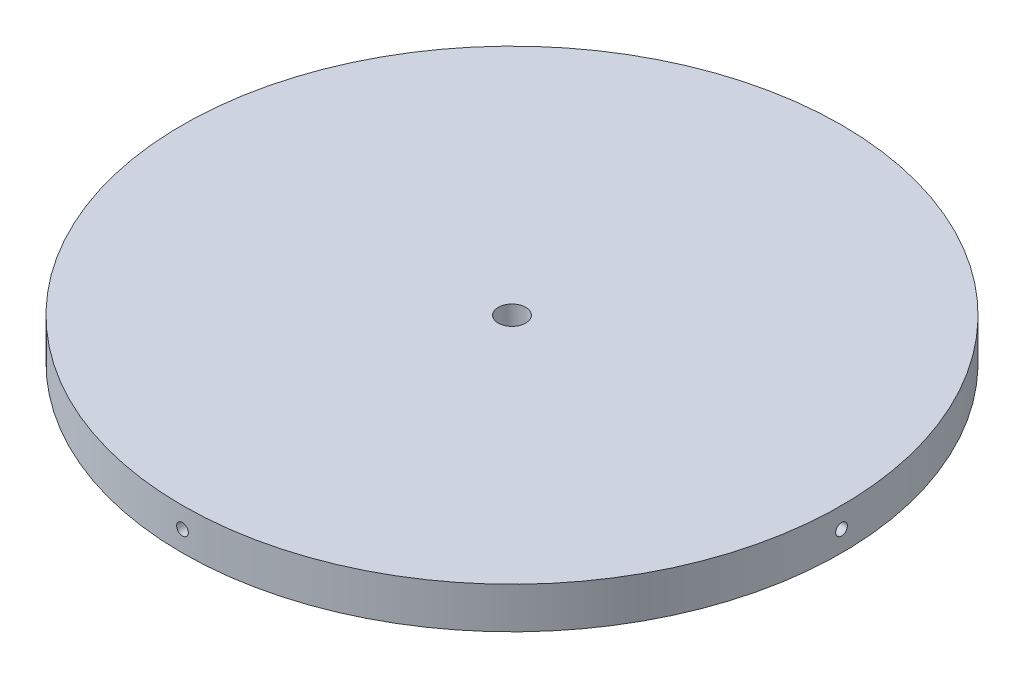
ISO-10303-21;
HEADER;
FILE_DESCRIPTION(('STEP AP214'),'2;1');
FILE_NAME('part.step','',(''),(''),'','','');
FILE_SCHEMA(('AUTOMOTIVE_DESIGN { 1 0 10303 214 1 1 1 1 }'));
ENDSEC;
DATA;
#1=APPLICATION_CONTEXT('core data for automotive mechanical design processes');
#2=APPLICATION_PROTOCOL_DEFINITION('international standard','automotive_design',2000,#1);
#3=PRODUCT_CONTEXT('',#1,'mechanical');
#4=PRODUCT('Part','Part','',(#3));
#5=PRODUCT_RELATED_PRODUCT_CATEGORY('part','',(#4));
#6=PRODUCT_DEFINITION_FORMATION('','',#4);
#7=PRODUCT_DEFINITION_CONTEXT('part definition',#1,'design');
#8=PRODUCT_DEFINITION('design','',#6,#7);
#9=PRODUCT_DEFINITION_SHAPE('','',#8);
#10=(LENGTH_UNIT() NAMED_UNIT(*) SI_UNIT(.MILLI.,.METRE.));
#11=(NAMED_UNIT(*) PLANE_ANGLE_UNIT() SI_UNIT($,.RADIAN.));
#12=(NAMED_UNIT(*) SI_UNIT($,.STERADIAN.) SOLID_ANGLE_UNIT());
#13=UNCERTAINTY_MEASURE_WITH_UNIT(LENGTH_MEASURE(1.E-05),#10,'distance_accuracy_value','');
#14=(GEOMETRIC_REPRESENTATION_CONTEXT(3) GLOBAL_UNCERTAINTY_ASSIGNED_CONTEXT((#13)) GLOBAL_UNIT_ASSIGNED_CONTEXT((#10,
#11,#12)) REPRESENTATION_CONTEXT('',''));
#15=CARTESIAN_POINT('',(0.,0.,0.));
#16=DIRECTION('',(0.,0.,1.));
#17=DIRECTION('',(1.,0.,0.));
#18=AXIS2_PLACEMENT_3D('',#15,#16,#17);
#19=CARTESIAN_POINT('',(0.,9.525,0.));
#20=DIRECTION('',(0.,1.,0.));
#21=DIRECTION('',(0.,0.,1.));
#22=AXIS2_PLACEMENT_3D('',#19,#20,#21);
#23=PLANE('',#22);
#24=CARTESIAN_POINT('',(0.,9.525,0.));
#25=DIRECTION('',(0.,1.,0.));
#26=DIRECTION('',(0.,0.,1.));
#27=AXIS2_PLACEMENT_3D('',#24,#25,#26);
#28=CIRCLE('',#27,76.1746);
#29=CARTESIAN_POINT('',(0.,9.525,76.1746));
#30=VERTEX_POINT('',#29);
#31=EDGE_CURVE('E87',#30,#30,#28,.T.);
#32=ORIENTED_EDGE('',*,*,#31,.T.);
#33=EDGE_LOOP('',(#32));
#34=FACE_BOUND('',#33,.T.);
#35=CARTESIAN_POINT('',(0.,9.525,0.));
#36=DIRECTION('',(0.,1.,0.));
#37=DIRECTION('',(0.,0.,1.));
#38=AXIS2_PLACEMENT_3D('',#35,#36,#37);
#39=CIRCLE('',#38,3.175);
#40=CARTESIAN_POINT('',(0.,9.525,-3.175));
#41=VERTEX_POINT('',#40);
#42=EDGE_CURVE('E81',#41,#41,#39,.T.);
#43=ORIENTED_EDGE('',*,*,#42,.F.);
#44=EDGE_LOOP('',(#43));
#45=FACE_BOUND('',#44,.T.);
#46=ADVANCED_FACE('F34',(#34,#45),#23,.T.);
#47=CARTESIAN_POINT('',(0.,0.,0.));
#48=DIRECTION('',(0.,1.,0.));
#49=DIRECTION('',(0.,0.,1.));
#50=AXIS2_PLACEMENT_3D('',#47,#48,#49);
#51=PLANE('',#50);
#52=CARTESIAN_POINT('',(0.,0.,0.));
#53=DIRECTION('',(0.,1.,0.));
#54=DIRECTION('',(0.,0.,1.));
#55=AXIS2_PLACEMENT_3D('',#52,#53,#54);
#56=CIRCLE('',#55,76.1746);
#57=CARTESIAN_POINT('',(0.,0.,76.1746));
#58=VERTEX_POINT('',#57);
#59=EDGE_CURVE('E84',#58,#58,#56,.T.);
#60=ORIENTED_EDGE('',*,*,#59,.F.);
#61=EDGE_LOOP('',(#60));
#62=FACE_BOUND('',#61,.T.);
#63=CARTESIAN_POINT('',(0.,0.,0.));
#64=DIRECTION('',(0.,1.,0.));
#65=DIRECTION('',(0.,0.,1.));
#66=AXIS2_PLACEMENT_3D('',#63,#64,#65);
#67=CIRCLE('',#66,3.175);
#68=CARTESIAN_POINT('',(0.,0.,-3.175));
#69=VERTEX_POINT('',#68);
#70=EDGE_CURVE('E80',#69,#69,#67,.T.);
#71=ORIENTED_EDGE('',*,*,#70,.T.);
#72=EDGE_LOOP('',(#71));
#73=FACE_BOUND('',#72,.T.);
#74=ADVANCED_FACE('F120',(#62,#73),#51,.F.);
#75=CARTESIAN_POINT('',(0.,9.525,0.));
#76=DIRECTION('',(0.,-1.,0.));
#77=DIRECTION('',(0.,0.,-1.));
#78=AXIS2_PLACEMENT_3D('',#75,#76,#77);
#79=CYLINDRICAL_SURFACE('',#78,76.1746);
#80=CARTESIAN_POINT('',(76.1625911695335,4.7625,-1.35255000000079));
#81=CARTESIAN_POINT('',(76.1625913318178,4.68653309786871,-1.35254663318594));
#82=CARTESIAN_POINT('',(76.1627060477417,4.61051126497765,-1.34612842213873));
#83=CARTESIAN_POINT('',(76.1631526381052,4.46056172084743,-1.3206142161901));
#84=CARTESIAN_POINT('',(76.1634847732258,4.3866366347137,-1.30150300224006));
#85=CARTESIAN_POINT('',(76.1643285653673,4.24307464772097,-1.25114740979543));
#86=CARTESIAN_POINT('',(76.1648401359019,4.17343569996043,-1.21990887577359));
#87=CARTESIAN_POINT('',(76.1659850439857,4.04041009425597,-1.14619354351088));
#88=CARTESIAN_POINT('',(76.1666183514398,3.9770218968928,-1.10371952185477));
#89=CARTESIAN_POINT('',(76.1679355660639,3.85826137607147,-1.00872536322316));
#90=CARTESIAN_POINT('',(76.1686194834858,3.80289068345009,-0.956203187386675));
#91=CARTESIAN_POINT('',(76.1699607411956,3.70175037900739,-0.84260635603765));
#92=CARTESIAN_POINT('',(76.1706180804338,3.65598114608205,-0.781531363169549));
#93=CARTESIAN_POINT('',(76.1718320812533,3.57534349835677,-0.652560465586628));
#94=CARTESIAN_POINT('',(76.1723887380619,3.54047560024732,-0.584664237767256));
#95=CARTESIAN_POINT('',(76.1733385746897,3.48263395049007,-0.443980593985543));
#96=CARTESIAN_POINT('',(76.1737317549518,3.45966016660453,-0.371193191280818));
#97=CARTESIAN_POINT('',(76.1743102772881,3.42626112549406,-0.222801407657146));
#98=CARTESIAN_POINT('',(76.1744956411789,3.41583455104581,-0.147197323296592));
#99=CARTESIAN_POINT('',(76.1746377065854,3.40782186013706,0.00468828794464257));
#100=CARTESIAN_POINT('',(76.1745944086883,3.41023571069592,0.0809698130848129));
#101=CARTESIAN_POINT('',(76.1742840512528,3.42783418744218,0.232035998008856));
#102=CARTESIAN_POINT('',(76.1740170168757,3.44301737759825,0.30682082514221));
#103=CARTESIAN_POINT('',(76.1732893175446,3.4857213252721,0.452779916711149));
#104=CARTESIAN_POINT('',(76.1728286523085,3.5132421007662,0.523954175885833));
#105=CARTESIAN_POINT('',(76.1717655783832,3.5798416417419,0.660676284030646));
#106=CARTESIAN_POINT('',(76.1711631616189,3.61892106571735,0.726223812172487));
#107=CARTESIAN_POINT('',(76.1698844932242,3.70752806105337,0.849828238940553));
#108=CARTESIAN_POINT('',(76.169208241554,3.75705563803346,0.907885133537938));
#109=CARTESIAN_POINT('',(76.1678580243648,3.86516117015754,1.01486865597108));
#110=CARTESIAN_POINT('',(76.1671840591745,3.92374037464282,1.06379402137592));
#111=CARTESIAN_POINT('',(76.165914493049,4.04828187743854,1.1511159371692));
#112=CARTESIAN_POINT('',(76.1653188921247,4.11424417678791,1.18951248607604));
#113=CARTESIAN_POINT('',(76.1642732138611,4.25168009404666,1.25468665966714));
#114=CARTESIAN_POINT('',(76.1638231370003,4.32315373007827,1.28146424614435));
#115=CARTESIAN_POINT('',(76.1631192730441,4.46958309676921,1.32263956423576));
#116=CARTESIAN_POINT('',(76.1628654857557,4.54453882400502,1.33703730802132));
#117=CARTESIAN_POINT('',(76.1625828484964,4.69579364816456,1.35304269240563));
#118=CARTESIAN_POINT('',(76.1625539678065,4.77209256020158,1.35465207971175));
#119=CARTESIAN_POINT('',(76.1627243198163,4.92387750401343,1.34503961511816));
#120=CARTESIAN_POINT('',(76.1629235524302,4.99936353609414,1.33381776804693));
#121=CARTESIAN_POINT('',(76.163527642029,5.14737504847621,1.29886283211518));
#122=CARTESIAN_POINT('',(76.1639324860076,5.21990071572595,1.27513053461639));
#123=CARTESIAN_POINT('',(76.1649021458778,5.3599384524946,1.21582918789614));
#124=CARTESIAN_POINT('',(76.1654669618686,5.42745051889775,1.18026013131863));
#125=CARTESIAN_POINT('',(76.1666929646331,5.55555265144326,1.09829045300828));
#126=CARTESIAN_POINT('',(76.1673541618726,5.61614196457616,1.05188865463172));
#127=CARTESIAN_POINT('',(76.1686983478926,5.72867110910763,0.949572408402749));
#128=CARTESIAN_POINT('',(76.1693813366983,5.78061093050641,0.893657949552762));
#129=CARTESIAN_POINT('',(76.1706921961768,5.87437249039245,0.773896138553624));
#130=CARTESIAN_POINT('',(76.1713200607014,5.9161931011722,0.710047903445597));
#131=CARTESIAN_POINT('',(76.172449800465,5.98852135229293,0.576235552859802));
#132=CARTESIAN_POINT('',(76.1729516758898,6.01902900933406,0.506271446410454));
#133=CARTESIAN_POINT('',(76.1737728288505,6.06786339526051,0.362217653866183));
#134=CARTESIAN_POINT('',(76.1740921174107,6.08619085957265,0.288128217147021));
#135=CARTESIAN_POINT('',(76.1745121451594,6.11014703050433,0.137923290346605));
#136=CARTESIAN_POINT('',(76.1746128841591,6.11577572614824,0.0618077985142768));
#137=CARTESIAN_POINT('',(76.1745844558271,6.11417445973102,-0.0902771157054055));
#138=CARTESIAN_POINT('',(76.1744553205151,6.10694628852903,-0.166246556960894));
#139=CARTESIAN_POINT('',(76.1739817621638,6.07984012377235,-0.315893573384177));
#140=CARTESIAN_POINT('',(76.1736373386937,6.05996210489637,-0.389571143964009));
#141=CARTESIAN_POINT('',(76.172772016909,6.00812045662003,-0.532544410246637));
#142=CARTESIAN_POINT('',(76.1722511153782,5.97615660696814,-0.601840026066066));
#143=CARTESIAN_POINT('',(76.171091570252,5.90105214198545,-0.734079137418544));
#144=CARTESIAN_POINT('',(76.1704529311519,5.85791195335362,-0.797022875331085));
#145=CARTESIAN_POINT('',(76.1691298427897,5.76167753104772,-0.914777610084021));
#146=CARTESIAN_POINT('',(76.1684453920218,5.70858297009328,-0.969588339420757));
#147=CARTESIAN_POINT('',(76.1671076722016,5.59393010957159,-1.06953236851041));
#148=CARTESIAN_POINT('',(76.1664544109313,5.53236971241236,-1.11466326276146));
#149=CARTESIAN_POINT('',(76.1652525839246,5.40251728126712,-1.193969380067));
#150=CARTESIAN_POINT('',(76.1647040746045,5.33422164974635,-1.22813870625481));
#151=CARTESIAN_POINT('',(76.1637747249306,5.19291543897584,-1.28448687045357));
#152=CARTESIAN_POINT('',(76.1633936840465,5.11991061945161,-1.30668005624902));
#153=CARTESIAN_POINT('',(76.162944445983,4.99911830304652,-1.33254273142713));
#154=CARTESIAN_POINT('',(76.1628125397191,4.95211539888689,-1.34003606670425));
#155=CARTESIAN_POINT('',(76.1626358507074,4.85758217076169,-1.35004075447477));
#156=CARTESIAN_POINT('',(76.1625910679508,4.81005184684975,-1.35255210747469));
#157=CARTESIAN_POINT('',(76.1625911695335,4.7625,-1.35255000000079));
#158=B_SPLINE_CURVE_WITH_KNOTS('',3,(#80,#81,#82,#83,#84,#85,#86,#87,#88,#89,#90,#91,#92,#93,
#94,#95,#96,#97,#98,#99,#100,#101,#102,#103,#104,#105,#106,#107,#108,#109,#110,#111,#112,#113,
#114,#115,#116,#117,#118,#119,#120,#121,#122,#123,#124,#125,#126,#127,#128,#129,#130,#131,#132,
#133,#134,#135,#136,#137,#138,#139,#140,#141,#142,#143,#144,#145,#146,#147,#148,#149,#150,#151,
#152,#153,#154,#155,#156,#157),.UNSPECIFIED.,.T.,.F.,(4,2,2,2,2,2,2,2,2,2,2,2,2,2,2,2,2,2,2,2,2,
2,2,2,2,2,2,2,2,2,2,2,2,2,2,2,2,2,4),(0.,0.227727140072635,0.455727821586148,0.683618759737946,
0.911453432568021,1.1393343842314,1.36722432691727,1.59512506926415,1.823025193907,
2.05090139119322,2.27877700317945,2.50662699185412,2.73447731251577,2.96234061626461,
3.19020404256931,3.41809894762149,3.64599388474286,3.8738895712536,4.10178503370631,
4.3296493683493,4.55751361724546,4.78536345407753,5.01321343250887,5.24108817134626,
5.46896317363123,5.69686355913317,5.9247636082078,6.15264989567459,6.38053638010493,
6.60839112424907,6.83624632449302,7.06410567735778,7.29195633211224,7.51981447946663,
7.7477291856114,7.97576629555885,8.20352960007281,8.34607651044311,8.48862340632087),.UNSPECIFIED.);
#159=CARTESIAN_POINT('',(76.1625911695335,4.7625,-1.35255000000079));
#160=VERTEX_POINT('',#159);
#161=EDGE_CURVE('E11',#160,#160,#158,.T.);
#162=ORIENTED_EDGE('',*,*,#161,.T.);
#163=EDGE_LOOP('',(#162));
#164=FACE_BOUND('',#163,.T.);
#165=CARTESIAN_POINT('',(1.35254999999999,4.7625,76.1625911695335));
#166=CARTESIAN_POINT('',(1.35254663318514,4.68653309786871,76.1625913318179));
#167=CARTESIAN_POINT('',(1.34612842213793,4.61051126497765,76.1627060477417));
#168=CARTESIAN_POINT('',(1.3206142161893,4.46056172084743,76.1631526381052));
#169=CARTESIAN_POINT('',(1.30150300223926,4.3866366347137,76.1634847732259));
#170=CARTESIAN_POINT('',(1.25114740979463,4.24307464772097,76.1643285653673));
#171=CARTESIAN_POINT('',(1.2199088757728,4.17343569996043,76.164840135902));
#172=CARTESIAN_POINT('',(1.14619354351008,4.04041009425597,76.1659850439857));
#173=CARTESIAN_POINT('',(1.10371952185397,3.9770218968928,76.1666183514398));
#174=CARTESIAN_POINT('',(1.00872536322236,3.85826137607147,76.1679355660639));
#175=CARTESIAN_POINT('',(0.956203187385877,3.80289068345009,76.1686194834858));
#176=CARTESIAN_POINT('',(0.842606356036852,3.70175037900739,76.1699607411956));
#177=CARTESIAN_POINT('',(0.781531363168751,3.65598114608205,76.1706180804338));
#178=CARTESIAN_POINT('',(0.65256046558583,3.57534349835677,76.1718320812533));
#179=CARTESIAN_POINT('',(0.584664237766458,3.54047560024732,76.1723887380619));
#180=CARTESIAN_POINT('',(0.443980593984745,3.48263395049007,76.1733385746897));
#181=CARTESIAN_POINT('',(0.371193191280021,3.45966016660453,76.1737317549518));
#182=CARTESIAN_POINT('',(0.222801407656348,3.42626112549406,76.1743102772881));
#183=CARTESIAN_POINT('',(0.147197323295794,3.41583455104581,76.1744956411789));
#184=CARTESIAN_POINT('',(-0.00468828794544046,3.40782186013706,76.1746377065854));
#185=CARTESIAN_POINT('',(-0.080969813085611,3.41023571069592,76.1745944086883));
#186=CARTESIAN_POINT('',(-0.232035998009655,3.42783418744218,76.1742840512528));
#187=CARTESIAN_POINT('',(-0.306820825143009,3.44301737759825,76.1740170168757));
#188=CARTESIAN_POINT('',(-0.452779916711947,3.4857213252721,76.1732893175446));
#189=CARTESIAN_POINT('',(-0.523954175886632,3.5132421007662,76.1728286523085));
#190=CARTESIAN_POINT('',(-0.660676284031444,3.5798416417419,76.1717655783832));
#191=CARTESIAN_POINT('',(-0.726223812173285,3.61892106571735,76.1711631616189));
#192=CARTESIAN_POINT('',(-0.849828238941351,3.70752806105337,76.1698844932242));
#193=CARTESIAN_POINT('',(-0.907885133538735,3.75705563803346,76.169208241554));
#194=CARTESIAN_POINT('',(-1.01486865597188,3.86516117015754,76.1678580243648));
#195=CARTESIAN_POINT('',(-1.06379402137672,3.92374037464282,76.1671840591745));
#196=CARTESIAN_POINT('',(-1.15111593717,4.04828187743854,76.1659144930489));
#197=CARTESIAN_POINT('',(-1.18951248607684,4.11424417678791,76.1653188921247));
#198=CARTESIAN_POINT('',(-1.25468665966794,4.25168009404666,76.1642732138611));
#199=CARTESIAN_POINT('',(-1.28146424614514,4.32315373007827,76.1638231370003));
#200=CARTESIAN_POINT('',(-1.32263956423656,4.46958309676921,76.1631192730441));
#201=CARTESIAN_POINT('',(-1.33703730802212,4.54453882400502,76.1628654857557));
#202=CARTESIAN_POINT('',(-1.35304269240643,4.69579364816456,76.1625828484964));
#203=CARTESIAN_POINT('',(-1.35465207971255,4.77209256020158,76.1625539678065));
#204=CARTESIAN_POINT('',(-1.34503961511896,4.92387750401343,76.1627243198163));
#205=CARTESIAN_POINT('',(-1.33381776804773,4.99936353609414,76.1629235524302));
#206=CARTESIAN_POINT('',(-1.29886283211598,5.14737504847621,76.1635276420289));
#207=CARTESIAN_POINT('',(-1.27513053461719,5.21990071572595,76.1639324860076));
#208=CARTESIAN_POINT('',(-1.21582918789694,5.3599384524946,76.1649021458777));
#209=CARTESIAN_POINT('',(-1.18026013131943,5.42745051889775,76.1654669618686));
#210=CARTESIAN_POINT('',(-1.09829045300907,5.55555265144326,76.1666929646331));
#211=CARTESIAN_POINT('',(-1.05188865463252,5.61614196457616,76.1673541618726));
#212=CARTESIAN_POINT('',(-0.949572408403547,5.72867110910763,76.1686983478926));
#213=CARTESIAN_POINT('',(-0.89365794955356,5.78061093050641,76.1693813366983));
#214=CARTESIAN_POINT('',(-0.773896138554421,5.87437249039245,76.1706921961767));
#215=CARTESIAN_POINT('',(-0.710047903446395,5.9161931011722,76.1713200607014));
#216=CARTESIAN_POINT('',(-0.576235552860599,5.98852135229293,76.1724498004649));
#217=CARTESIAN_POINT('',(-0.506271446411252,6.01902900933406,76.1729516758898));
#218=CARTESIAN_POINT('',(-0.362217653866981,6.06786339526051,76.1737728288505));
#219=CARTESIAN_POINT('',(-0.288128217147819,6.08619085957265,76.1740921174107));
#220=CARTESIAN_POINT('',(-0.137923290347403,6.11014703050433,76.1745121451594));
#221=CARTESIAN_POINT('',(-0.0618077985150745,6.11577572614824,76.1746128841591));
#222=CARTESIAN_POINT('',(0.0902771157046079,6.11417445973102,76.1745844558271));
#223=CARTESIAN_POINT('',(0.166246556960096,6.10694628852903,76.1744553205151));
#224=CARTESIAN_POINT('',(0.315893573383379,6.07984012377235,76.1739817621638));
#225=CARTESIAN_POINT('',(0.389571143963211,6.05996210489637,76.1736373386937));
#226=CARTESIAN_POINT('',(0.53254441024584,6.00812045662003,76.172772016909));
#227=CARTESIAN_POINT('',(0.601840026065269,5.97615660696814,76.1722511153782));
#228=CARTESIAN_POINT('',(0.734079137417747,5.90105214198545,76.171091570252));
#229=CARTESIAN_POINT('',(0.797022875330288,5.85791195335362,76.1704529311519));
#230=CARTESIAN_POINT('',(0.914777610083223,5.76167753104772,76.1691298427897));
#231=CARTESIAN_POINT('',(0.969588339419959,5.70858297009328,76.1684453920218));
#232=CARTESIAN_POINT('',(1.06953236850961,5.59393010957159,76.1671076722016));
#233=CARTESIAN_POINT('',(1.11466326276066,5.53236971241236,76.1664544109313));
#234=CARTESIAN_POINT('',(1.1939693800662,5.40251728126712,76.1652525839247));
#235=CARTESIAN_POINT('',(1.22813870625402,5.33422164974635,76.1647040746045));
#236=CARTESIAN_POINT('',(1.28448687045277,5.19291543897584,76.1637747249306));
#237=CARTESIAN_POINT('',(1.30668005624822,5.11991061945161,76.1633936840466));
#238=CARTESIAN_POINT('',(1.33254273142633,4.99911830304652,76.162944445983));
#239=CARTESIAN_POINT('',(1.34003606670345,4.95211539888689,76.1628125397191));
#240=CARTESIAN_POINT('',(1.35004075447398,4.85758217076169,76.1626358507074));
#241=CARTESIAN_POINT('',(1.3525521074739,4.81005184684975,76.1625910679508));
#242=CARTESIAN_POINT('',(1.35254999999999,4.7625,76.1625911695335));
#243=B_SPLINE_CURVE_WITH_KNOTS('',3,(#165,#166,#167,#168,#169,#170,#171,#172,#173,#174,#175,
#176,#177,#178,#179,#180,#181,#182,#183,#184,#185,#186,#187,#188,#189,#190,#191,#192,#193,#194,
#195,#196,#197,#198,#199,#200,#201,#202,#203,#204,#205,#206,#207,#208,#209,#210,#211,#212,#213,
#214,#215,#216,#217,#218,#219,#220,#221,#222,#223,#224,#225,#226,#227,#228,#229,#230,#231,#232,
#233,#234,#235,#236,#237,#238,#239,#240,#241,#242),.UNSPECIFIED.,.T.,.F.,(4,2,2,2,2,2,2,2,2,2,2,
2,2,2,2,2,2,2,2,2,2,2,2,2,2,2,2,2,2,2,2,2,2,2,2,2,2,2,4),(0.,0.227727140072635,
0.455727821586148,0.683618759737946,0.91145343256802,1.1393343842314,1.36722432691727,
1.59512506926415,1.823025193907,2.05090139119322,2.27877700317946,2.50662699185412,
2.73447731251577,2.96234061626461,3.19020404256931,3.41809894762149,3.64599388474286,
3.8738895712536,4.10178503370631,4.3296493683493,4.55751361724546,4.78536345407753,
5.01321343250887,5.24108817134626,5.46896317363123,5.69686355913317,5.9247636082078,
6.15264989567459,6.38053638010493,6.60839112424907,6.83624632449302,7.06410567735778,
7.29195633211224,7.51981447946663,7.7477291856114,7.97576629555885,8.20352960007281,
8.34607651044311,8.48862340632087),.UNSPECIFIED.);
#244=CARTESIAN_POINT('',(1.35254999999999,4.7625,76.1625911695335));
#245=VERTEX_POINT('',#244);
#246=EDGE_CURVE('E47',#245,#245,#243,.T.);
#247=ORIENTED_EDGE('',*,*,#246,.T.);
#248=EDGE_LOOP('',(#247));
#249=FACE_BOUND('',#248,.T.);
#250=CARTESIAN_POINT('',(-76.1625911695335,4.7625,1.35255000000025));
#251=CARTESIAN_POINT('',(-76.1625913318179,4.68653309786871,1.35254663318541));
#252=CARTESIAN_POINT('',(-76.1627060477417,4.61051126497765,1.3461284221382));
#253=CARTESIAN_POINT('',(-76.1631526381052,4.46056172084743,1.32061421618956));
#254=CARTESIAN_POINT('',(-76.1634847732259,4.3866366347137,1.30150300223953));
#255=CARTESIAN_POINT('',(-76.1643285653673,4.24307464772097,1.2511474097949));
#256=CARTESIAN_POINT('',(-76.164840135902,4.17343569996043,1.21990887577306));
#257=CARTESIAN_POINT('',(-76.1659850439857,4.04041009425597,1.14619354351035));
#258=CARTESIAN_POINT('',(-76.1666183514398,3.9770218968928,1.10371952185424));
#259=CARTESIAN_POINT('',(-76.1679355660639,3.85826137607147,1.00872536322262));
#260=CARTESIAN_POINT('',(-76.1686194834858,3.80289068345009,0.956203187386144));
#261=CARTESIAN_POINT('',(-76.1699607411956,3.70175037900739,0.842606356037118));
#262=CARTESIAN_POINT('',(-76.1706180804338,3.65598114608205,0.781531363169017));
#263=CARTESIAN_POINT('',(-76.1718320812533,3.57534349835677,0.652560465586096));
#264=CARTESIAN_POINT('',(-76.1723887380619,3.54047560024732,0.584664237766724));
#265=CARTESIAN_POINT('',(-76.1733385746897,3.48263395049007,0.443980593985011));
#266=CARTESIAN_POINT('',(-76.1737317549518,3.45966016660453,0.371193191280286));
#267=CARTESIAN_POINT('',(-76.1743102772881,3.42626112549406,0.222801407656614));
#268=CARTESIAN_POINT('',(-76.1744956411789,3.41583455104581,0.14719732329606));
#269=CARTESIAN_POINT('',(-76.1746377065854,3.40782186013706,-0.00468828794517483));
#270=CARTESIAN_POINT('',(-76.1745944086883,3.41023571069592,-0.0809698130853454));
#271=CARTESIAN_POINT('',(-76.1742840512528,3.42783418744218,-0.232035998009389));
#272=CARTESIAN_POINT('',(-76.1740170168757,3.44301737759825,-0.306820825142744));
#273=CARTESIAN_POINT('',(-76.1732893175446,3.4857213252721,-0.452779916711682));
#274=CARTESIAN_POINT('',(-76.1728286523085,3.5132421007662,-0.523954175886366));
#275=CARTESIAN_POINT('',(-76.1717655783832,3.5798416417419,-0.660676284031178));
#276=CARTESIAN_POINT('',(-76.1711631616189,3.61892106571735,-0.726223812173019));
#277=CARTESIAN_POINT('',(-76.1698844932242,3.70752806105337,-0.849828238941086));
#278=CARTESIAN_POINT('',(-76.169208241554,3.75705563803346,-0.90788513353847));
#279=CARTESIAN_POINT('',(-76.1678580243648,3.86516117015754,-1.01486865597161));
#280=CARTESIAN_POINT('',(-76.1671840591745,3.92374037464282,-1.06379402137645));
#281=CARTESIAN_POINT('',(-76.1659144930489,4.04828187743854,-1.15111593716974));
#282=CARTESIAN_POINT('',(-76.1653188921247,4.11424417678791,-1.18951248607658));
#283=CARTESIAN_POINT('',(-76.1642732138611,4.25168009404666,-1.25468665966767));
#284=CARTESIAN_POINT('',(-76.1638231370003,4.32315373007827,-1.28146424614488));
#285=CARTESIAN_POINT('',(-76.1631192730441,4.46958309676921,-1.32263956423629));
#286=CARTESIAN_POINT('',(-76.1628654857557,4.54453882400502,-1.33703730802185));
#287=CARTESIAN_POINT('',(-76.1625828484964,4.69579364816457,-1.35304269240616));
#288=CARTESIAN_POINT('',(-76.1625539678065,4.77209256020158,-1.35465207971228));
#289=CARTESIAN_POINT('',(-76.1627243198163,4.92387750401343,-1.34503961511869));
#290=CARTESIAN_POINT('',(-76.1629235524302,4.99936353609414,-1.33381776804746));
#291=CARTESIAN_POINT('',(-76.163527642029,5.14737504847621,-1.29886283211571));
#292=CARTESIAN_POINT('',(-76.1639324860076,5.21990071572595,-1.27513053461692));
#293=CARTESIAN_POINT('',(-76.1649021458777,5.3599384524946,-1.21582918789667));
#294=CARTESIAN_POINT('',(-76.1654669618686,5.42745051889775,-1.18026013131916));
#295=CARTESIAN_POINT('',(-76.1666929646331,5.55555265144326,-1.09829045300881));
#296=CARTESIAN_POINT('',(-76.1673541618726,5.61614196457616,-1.05188865463225));
#297=CARTESIAN_POINT('',(-76.1686983478926,5.72867110910763,-0.949572408403281));
#298=CARTESIAN_POINT('',(-76.1693813366983,5.78061093050641,-0.893657949553294));
#299=CARTESIAN_POINT('',(-76.1706921961767,5.87437249039245,-0.773896138554155));
#300=CARTESIAN_POINT('',(-76.1713200607014,5.9161931011722,-0.710047903446129));
#301=CARTESIAN_POINT('',(-76.172449800465,5.98852135229293,-0.576235552860333));
#302=CARTESIAN_POINT('',(-76.1729516758898,6.01902900933406,-0.506271446410986));
#303=CARTESIAN_POINT('',(-76.1737728288505,6.06786339526051,-0.362217653866714));
#304=CARTESIAN_POINT('',(-76.1740921174107,6.08619085957265,-0.288128217147552));
#305=CARTESIAN_POINT('',(-76.1745121451594,6.11014703050433,-0.137923290347137));
#306=CARTESIAN_POINT('',(-76.1746128841591,6.11577572614824,-0.061807798514808));
#307=CARTESIAN_POINT('',(-76.1745844558271,6.11417445973102,0.0902771157048748));
#308=CARTESIAN_POINT('',(-76.1744553205151,6.10694628852903,0.166246556960363));
#309=CARTESIAN_POINT('',(-76.1739817621638,6.07984012377235,0.315893573383646));
#310=CARTESIAN_POINT('',(-76.1736373386937,6.05996210489637,0.389571143963478));
#311=CARTESIAN_POINT('',(-76.172772016909,6.00812045662003,0.532544410246106));
#312=CARTESIAN_POINT('',(-76.1722511153782,5.97615660696814,0.601840026065535));
#313=CARTESIAN_POINT('',(-76.171091570252,5.90105214198545,0.734079137418013));
#314=CARTESIAN_POINT('',(-76.1704529311519,5.85791195335362,0.797022875330554));
#315=CARTESIAN_POINT('',(-76.1691298427897,5.76167753104772,0.91477761008349));
#316=CARTESIAN_POINT('',(-76.1684453920219,5.70858297009328,0.969588339420225));
#317=CARTESIAN_POINT('',(-76.1671076722016,5.59393010957159,1.06953236850988));
#318=CARTESIAN_POINT('',(-76.1664544109313,5.53236971241236,1.11466326276093));
#319=CARTESIAN_POINT('',(-76.1652525839246,5.40251728126712,1.19396938006647));
#320=CARTESIAN_POINT('',(-76.1647040746045,5.33422164974635,1.22813870625428));
#321=CARTESIAN_POINT('',(-76.1637747249306,5.19291543897584,1.28448687045303));
#322=CARTESIAN_POINT('',(-76.1633936840466,5.1199106194516,1.30668005624849));
#323=CARTESIAN_POINT('',(-76.162944445983,4.99911830304651,1.3325427314266));
#324=CARTESIAN_POINT('',(-76.1628125397191,4.95211539888689,1.34003606670372));
#325=CARTESIAN_POINT('',(-76.1626358507074,4.85758217076169,1.35004075447424));
#326=CARTESIAN_POINT('',(-76.1625910679508,4.81005184684975,1.35255210747416));
#327=CARTESIAN_POINT('',(-76.1625911695335,4.7625,1.35255000000025));
#328=B_SPLINE_CURVE_WITH_KNOTS('',3,(#250,#251,#252,#253,#254,#255,#256,#257,#258,#259,#260,
#261,#262,#263,#264,#265,#266,#267,#268,#269,#270,#271,#272,#273,#274,#275,#276,#277,#278,#279,
#280,#281,#282,#283,#284,#285,#286,#287,#288,#289,#290,#291,#292,#293,#294,#295,#296,#297,#298,
#299,#300,#301,#302,#303,#304,#305,#306,#307,#308,#309,#310,#311,#312,#313,#314,#315,#316,#317,
#318,#319,#320,#321,#322,#323,#324,#325,#326,#327),.UNSPECIFIED.,.T.,.F.,(4,2,2,2,2,2,2,2,2,2,2,
2,2,2,2,2,2,2,2,2,2,2,2,2,2,2,2,2,2,2,2,2,2,2,2,2,2,2,4),(0.,0.227727140072635,
0.455727821586148,0.683618759737944,0.91145343256802,1.1393343842314,1.36722432691727,
1.59512506926415,1.823025193907,2.05090139119322,2.27877700317946,2.50662699185412,
2.73447731251577,2.96234061626461,3.19020404256931,3.41809894762149,3.64599388474286,
3.8738895712536,4.10178503370631,4.3296493683493,4.55751361724546,4.78536345407753,
5.01321343250888,5.24108817134626,5.46896317363123,5.69686355913317,5.9247636082078,
6.15264989567459,6.38053638010493,6.60839112424907,6.83624632449302,7.06410567735778,
7.29195633211224,7.51981447946663,7.7477291856114,7.97576629555885,8.20352960007281,
8.34607651044311,8.48862340632087),.UNSPECIFIED.);
#329=CARTESIAN_POINT('',(-76.1625911695335,4.7625,1.35255000000025));
#330=VERTEX_POINT('',#329);
#331=EDGE_CURVE('E99',#330,#330,#328,.T.);
#332=ORIENTED_EDGE('',*,*,#331,.T.);
#333=EDGE_LOOP('',(#332));
#334=FACE_BOUND('',#333,.T.);
#335=CARTESIAN_POINT('',(0.,6.11504999999999,-76.1746));
#336=CARTESIAN_POINT('',(-0.0759669031959398,6.11504663318611,-76.1745998378203));
#337=CARTESIAN_POINT('',(-0.151988737147994,6.10862842196507,-76.1744851405251));
#338=CARTESIAN_POINT('',(-0.301938283482509,6.0831142152633,-76.1740386164844));
#339=CARTESIAN_POINT('',(-0.375863370760367,6.06400300073754,-76.1737065290927));
#340=CARTESIAN_POINT('',(-0.519425360171584,6.01364740660829,-76.1728628406467));
#341=CARTESIAN_POINT('',(-0.589064309196794,5.98240887145006,-76.1723513260741));
#342=CARTESIAN_POINT('',(-0.722089917016071,5.90869353651212,-76.1712065135406));
#343=CARTESIAN_POINT('',(-0.785478115230995,5.86621951332,-76.1705732456787));
#344=CARTESIAN_POINT('',(-0.904238635073783,5.77122535314371,-76.1692560766181));
#345=CARTESIAN_POINT('',(-0.959609326138674,5.71870317764102,-76.1685721651624));
#346=CARTESIAN_POINT('',(-1.06074962758195,5.60510634761105,-76.1672308830571));
#347=CARTESIAN_POINT('',(-1.1065188590596,5.544031355724,-76.1665735134558));
#348=CARTESIAN_POINT('',(-1.18715650528408,5.41506045898393,-76.1653594289303));
#349=CARTESIAN_POINT('',(-1.22202440307092,5.34716423085783,-76.1648027187802));
#350=CARTESIAN_POINT('',(-1.27986605214682,5.20648058640919,-76.1638527758335));
#351=CARTESIAN_POINT('',(-1.30283983567756,5.13369318334589,-76.1634595425938));
#352=CARTESIAN_POINT('',(-1.33623887602735,4.98530139869178,-76.1628809379442));
#353=CARTESIAN_POINT('',(-1.34666545004531,4.90969731365389,-76.1626955447155));
#354=CARTESIAN_POINT('',(-1.35467813985884,4.75781170109146,-76.1625534570781));
#355=CARTESIAN_POINT('',(-1.35226428863958,4.68153017530768,-76.1625967620819));
#356=CARTESIAN_POINT('',(-1.33466581086186,4.53046399333399,-76.1629071671051));
#357=CARTESIAN_POINT('',(-1.31948262099914,4.45567916971715,-76.1631742419478));
#358=CARTESIAN_POINT('',(-1.27677867513642,4.30972008503016,-76.1639020377809));
#359=CARTESIAN_POINT('',(-1.24925790115358,4.23854582922281,-76.1643627590535));
#360=CARTESIAN_POINT('',(-1.18265836327778,4.10182372510504,-76.1654259361396));
#361=CARTESIAN_POINT('',(-1.14357894053353,4.03627619779705,-76.166028400032));
#362=CARTESIAN_POINT('',(-1.05497194780953,3.91267177217164,-76.1673071330586));
#363=CARTESIAN_POINT('',(-1.00544437221108,3.85461487788248,-76.1679834022326));
#364=CARTESIAN_POINT('',(-0.897338841049925,3.74763135383609,-76.1693336172077));
#365=CARTESIAN_POINT('',(-0.838759635868295,3.69870598679023,-76.1700075626749));
#366=CARTESIAN_POINT('',(-0.714218131100806,3.61138406802023,-76.1712770606937));
#367=CARTESIAN_POINT('',(-0.648255830478291,3.57298751777443,-76.1718726132344));
#368=CARTESIAN_POINT('',(-0.510819912911578,3.50781334322623,-76.1729181873081));
#369=CARTESIAN_POINT('',(-0.439346278044282,3.48103575671107,-76.1733682083677));
#370=CARTESIAN_POINT('',(-0.292916913878398,3.43986043818532,-76.1740719777359));
#371=CARTESIAN_POINT('',(-0.217961188001414,3.42546269401023,-76.1743257262373));
#372=CARTESIAN_POINT('',(-0.0667063644147724,3.40945730816293,-76.1746083200011));
#373=CARTESIAN_POINT('',(0.00959254844751346,3.40784792015508,-76.1746371959715));
#374=CARTESIAN_POINT('',(0.161377494079737,3.41746038363994,-76.1744668705921));
#375=CARTESIAN_POINT('',(0.236863527155562,3.42868223030407,-76.1742676693282));
#376=CARTESIAN_POINT('',(0.384875044189094,3.46363716640883,-76.173663664801));
#377=CARTESIAN_POINT('',(0.457400714997972,3.48736946489914,-76.1732588745357));
#378=CARTESIAN_POINT('',(0.597438458444466,3.54667081479803,-76.1722893208728));
#379=CARTESIAN_POINT('',(0.664950527968757,3.58223987355686,-76.1717245573758));
#380=CARTESIAN_POINT('',(0.793052662549558,3.66420955502574,-76.1704986354668));
#381=CARTESIAN_POINT('',(0.853641974951883,3.71061135382428,-76.1698374665911));
#382=CARTESIAN_POINT('',(0.966171117811906,3.812927600488,-76.1684933006567));
#383=CARTESIAN_POINT('',(1.0181109382667,3.86884205935417,-76.1678103035729));
#384=CARTESIAN_POINT('',(1.11187249624285,3.98860386992294,-76.1664993945718));
#385=CARTESIAN_POINT('',(1.15369310605572,4.05245210458512,-76.1658714887992));
#386=CARTESIAN_POINT('',(1.22602135547702,4.18626445403353,-76.1647416515947));
#387=CARTESIAN_POINT('',(1.25652901178564,4.25622855979132,-76.1642397199769));
#388=CARTESIAN_POINT('',(1.30536339719808,4.40028235287769,-76.1634184643603));
#389=CARTESIAN_POINT('',(1.32369086141227,4.47437179093779,-76.1630991293414));
#390=CARTESIAN_POINT('',(1.34764703169322,4.6245767205557,-76.1626790387343));
#391=CARTESIAN_POINT('',(1.35327572679142,4.70069221386346,-76.1625782833351));
#392=CARTESIAN_POINT('',(1.35167445883825,4.85277712704119,-76.1626067161695));
#393=CARTESIAN_POINT('',(1.34444628729294,4.92874656578615,-76.1627358723668));
#394=CARTESIAN_POINT('',(1.31734012273543,5.07839357710609,-76.1632095005568));
#395=CARTESIAN_POINT('',(1.29746210439744,5.15207114509229,-76.1635539729806));
#396=CARTESIAN_POINT('',(1.24562045811338,5.29504440637428,-76.1644193993455));
#397=CARTESIAN_POINT('',(1.21365660991066,5.36434001978482,-76.164940356503));
#398=CARTESIAN_POINT('',(1.1385521485672,5.49657912692842,-76.1660999951169));
#399=CARTESIAN_POINT('',(1.09541196212285,5.55952286303949,-76.1667386720787));
#400=CARTESIAN_POINT('',(0.999177542161064,5.67727759804536,-76.168061801904));
#401=CARTESIAN_POINT('',(0.946082980867527,5.73208832903134,-76.1687462562743));
#402=CARTESIAN_POINT('',(0.831430118997713,5.83203236128946,-76.1700839473755));
#403=CARTESIAN_POINT('',(0.769869720832981,5.87716325706396,-76.1707371763155));
#404=CARTESIAN_POINT('',(0.640017288932585,5.95646937593903,-76.1719389169514));
#405=CARTESIAN_POINT('',(0.571721657840508,5.99063870246546,-76.1724873722223));
#406=CARTESIAN_POINT('',(0.430415447990483,6.04698686741764,-76.1734166157479));
#407=CARTESIAN_POINT('',(0.357410628955742,6.06918005362238,-76.1737976045306));
#408=CARTESIAN_POINT('',(0.236618311449319,6.09504272999781,-76.174246777958));
#409=CARTESIAN_POINT('',(0.189615405614296,6.10253606581219,-76.1743786641761));
#410=CARTESIAN_POINT('',(0.0950821741295524,6.11254075429683,-76.1745553259513));
#411=CARTESIAN_POINT('',(0.0475518485334259,6.11505210747334,-76.1746001015172));
#412=CARTESIAN_POINT('',(0.,6.11504999999999,-76.1746));
#413=B_SPLINE_CURVE_WITH_KNOTS('',3,(#335,#336,#337,#338,#339,#340,#341,#342,#343,#344,#345,
#346,#347,#348,#349,#350,#351,#352,#353,#354,#355,#356,#357,#358,#359,#360,#361,#362,#363,#364,
#365,#366,#367,#368,#369,#370,#371,#372,#373,#374,#375,#376,#377,#378,#379,#380,#381,#382,#383,
#384,#385,#386,#387,#388,#389,#390,#391,#392,#393,#394,#395,#396,#397,#398,#399,#400,#401,#402,
#403,#404,#405,#406,#407,#408,#409,#410,#411,#412),.UNSPECIFIED.,.T.,.F.,(4,2,2,2,2,2,2,2,2,2,2,
2,2,2,2,2,2,2,2,2,2,2,2,2,2,2,2,2,2,2,2,2,2,2,2,2,2,2,4),(0.,0.227727143269717,
0.455727827910921,0.683618769709577,0.911453446130337,1.13933439361215,1.36722433222943,
1.59512507614102,1.82302520227312,2.05090140149201,2.27877701533088,2.50662699400251,
2.73447730478141,2.96234060569549,3.19020402914776,3.41809893834134,3.6459938795335,
3.87388956188116,4.10178502029675,4.32964935752718,4.5575136090091,4.78536345592028,
5.01321344431952,5.24108818144064,5.4689631820908,5.6968635659797,5.92476361344074,
6.15264990521509,6.38053639382594,6.60839113068469,6.8362463237248,7.06410566948288,
7.29195631718295,7.51981446883156,7.74772917917171,7.97576628724141,8.20352958998387,
8.34607650539727,8.4886234063257),.UNSPECIFIED.);
#414=CARTESIAN_POINT('',(0.,6.11504999999999,-76.1746));
#415=VERTEX_POINT('',#414);
#416=EDGE_CURVE('E90',#415,#415,#413,.T.);
#417=ORIENTED_EDGE('',*,*,#416,.T.);
#418=EDGE_LOOP('',(#417));
#419=FACE_BOUND('',#418,.T.);
#420=ORIENTED_EDGE('',*,*,#31,.F.);
#421=EDGE_LOOP('',(#420));
#422=FACE_BOUND('',#421,.T.);
#423=ORIENTED_EDGE('',*,*,#59,.T.);
#424=EDGE_LOOP('',(#423));
#425=FACE_BOUND('',#424,.T.);
#426=ADVANCED_FACE('F36',(#164,#249,#334,#419,#422,#425),#79,.T.);
#427=CARTESIAN_POINT('',(0.,9.525,0.));
#428=DIRECTION('',(0.,-1.,0.));
#429=DIRECTION('',(0.,0.,-1.));
#430=AXIS2_PLACEMENT_3D('',#427,#428,#429);
#431=CYLINDRICAL_SURFACE('',#430,3.175);
#432=CARTESIAN_POINT('',(0.,9.525,-3.175));
#433=CARTESIAN_POINT('',(0.,9.42578125,-3.175));
#434=CARTESIAN_POINT('',(0.,9.3265625,-3.175));
#435=CARTESIAN_POINT('',(0.,9.128125,-3.175));
#436=CARTESIAN_POINT('',(0.,9.02890625,-3.175));
#437=CARTESIAN_POINT('',(0.,8.83046875,-3.175));
#438=CARTESIAN_POINT('',(0.,8.73125,-3.175));
#439=CARTESIAN_POINT('',(0.,8.5328125,-3.175));
#440=CARTESIAN_POINT('',(0.,8.43359375,-3.175));
#441=CARTESIAN_POINT('',(0.,8.23515625,-3.175));
#442=CARTESIAN_POINT('',(0.,8.1359375,-3.175));
#443=CARTESIAN_POINT('',(0.,7.9375,-3.175));
#444=CARTESIAN_POINT('',(0.,7.83828125,-3.175));
#445=CARTESIAN_POINT('',(0.,7.63984375,-3.175));
#446=CARTESIAN_POINT('',(0.,7.540625,-3.175));
#447=CARTESIAN_POINT('',(0.,7.3421875,-3.175));
#448=CARTESIAN_POINT('',(0.,7.24296875,-3.175));
#449=CARTESIAN_POINT('',(0.,7.04453125,-3.175));
#450=CARTESIAN_POINT('',(0.,6.9453125,-3.175));
#451=CARTESIAN_POINT('',(0.,6.746875,-3.175));
#452=CARTESIAN_POINT('',(0.,6.64765625,-3.175));
#453=CARTESIAN_POINT('',(0.,6.44921875,-3.175));
#454=CARTESIAN_POINT('',(0.,6.35,-3.175));
#455=CARTESIAN_POINT('',(0.,6.1515625,-3.175));
#456=CARTESIAN_POINT('',(0.,6.05234375,-3.175));
#457=CARTESIAN_POINT('',(0.,5.85390625,-3.175));
#458=CARTESIAN_POINT('',(0.,5.7546875,-3.175));
#459=CARTESIAN_POINT('',(0.,5.55625,-3.175));
#460=CARTESIAN_POINT('',(0.,5.45703125,-3.175));
#461=CARTESIAN_POINT('',(0.,5.25859375,-3.175));
#462=CARTESIAN_POINT('',(0.,5.159375,-3.175));
#463=CARTESIAN_POINT('',(0.,4.9609375,-3.175));
#464=CARTESIAN_POINT('',(0.,4.86171875,-3.175));
#465=CARTESIAN_POINT('',(0.,4.66328125,-3.175));
#466=CARTESIAN_POINT('',(0.,4.5640625,-3.175));
#467=CARTESIAN_POINT('',(0.,4.365625,-3.175));
#468=CARTESIAN_POINT('',(0.,4.26640625,-3.175));
#469=CARTESIAN_POINT('',(0.,4.06796875,-3.175));
#470=CARTESIAN_POINT('',(0.,3.96875,-3.175));
#471=CARTESIAN_POINT('',(0.,3.7703125,-3.175));
#472=CARTESIAN_POINT('',(0.,3.67109375,-3.175));
#473=CARTESIAN_POINT('',(0.,3.47265625,-3.175));
#474=CARTESIAN_POINT('',(0.,3.3734375,-3.175));
#475=CARTESIAN_POINT('',(0.,3.175,-3.175));
#476=CARTESIAN_POINT('',(0.,3.07578125,-3.175));
#477=CARTESIAN_POINT('',(0.,2.87734375,-3.175));
#478=CARTESIAN_POINT('',(0.,2.778125,-3.175));
#479=CARTESIAN_POINT('',(0.,2.5796875,-3.175));
#480=CARTESIAN_POINT('',(0.,2.48046875,-3.175));
#481=CARTESIAN_POINT('',(0.,2.28203125,-3.175));
#482=CARTESIAN_POINT('',(0.,2.1828125,-3.175));
#483=CARTESIAN_POINT('',(0.,1.984375,-3.175));
#484=CARTESIAN_POINT('',(0.,1.88515625,-3.175));
#485=CARTESIAN_POINT('',(0.,1.68671875,-3.175));
#486=CARTESIAN_POINT('',(0.,1.5875,-3.175));
#487=CARTESIAN_POINT('',(0.,1.3890625,-3.175));
#488=CARTESIAN_POINT('',(0.,1.28984375,-3.175));
#489=CARTESIAN_POINT('',(0.,1.09140625,-3.175));
#490=CARTESIAN_POINT('',(0.,0.992187500000001,-3.175));
#491=CARTESIAN_POINT('',(0.,0.793750000000001,-3.175));
#492=CARTESIAN_POINT('',(0.,0.69453125,-3.175));
#493=CARTESIAN_POINT('',(0.,0.49609375,-3.175));
#494=CARTESIAN_POINT('',(0.,0.396875,-3.175));
#495=CARTESIAN_POINT('',(0.,0.1984375,-3.175));
#496=CARTESIAN_POINT('',(0.,0.0992187500000001,-3.175));
#497=CARTESIAN_POINT('',(0.,0.,-3.175));
#498=B_SPLINE_CURVE_WITH_KNOTS('',3,(#432,#433,#434,#435,#436,#437,#438,#439,#440,#441,#442,
#443,#444,#445,#446,#447,#448,#449,#450,#451,#452,#453,#454,#455,#456,#457,#458,#459,#460,#461,
#462,#463,#464,#465,#466,#467,#468,#469,#470,#471,#472,#473,#474,#475,#476,#477,#478,#479,#480,
#481,#482,#483,#484,#485,#486,#487,#488,#489,#490,#491,#492,#493,#494,#495,#496,#497),
.UNSPECIFIED.,.F.,.F.,(4,2,2,2,2,2,2,2,2,2,2,2,2,2,2,2,2,2,2,2,2,2,2,2,2,2,2,2,2,2,2,2,4),(0.,
0.29765625,0.5953125,0.892968750000001,1.190625,1.48828125,1.7859375,2.08359375,2.38125,
2.67890625,2.9765625,3.27421875,3.571875,3.86953125,4.1671875,4.46484375,4.7625,5.06015625,
5.3578125,5.65546875,5.953125,6.25078125,6.5484375,6.84609375,7.14375,7.44140625,7.7390625,
8.03671875,8.334375,8.63203125,8.9296875,9.22734375,9.525),.UNSPECIFIED.);
#499=EDGE_CURVE('BSEAM110',#41,#69,#498,.T.);
#500=ORIENTED_EDGE('',*,*,#42,.T.);
#501=ORIENTED_EDGE('',*,*,#70,.F.);
#502=ORIENTED_EDGE('',*,*,#499,.T.);
#503=ORIENTED_EDGE('',*,*,#499,.F.);
#504=EDGE_LOOP('',(#500,#502,#501,#503));
#505=FACE_BOUND('',#504,.T.);
#506=ADVANCED_FACE('F110',(#505),#431,.F.);
#507=CARTESIAN_POINT('',(0.,4.7625,-76.1746));
#508=DIRECTION('',(0.,0.,-1.));
#509=DIRECTION('',(-1.,0.,0.));
#510=AXIS2_PLACEMENT_3D('',#507,#508,#509);
#511=CYLINDRICAL_SURFACE('',#510,1.35254999999999);
#512=CARTESIAN_POINT('',(0.,4.7625,-66.5226));
#513=DIRECTION('',(0.,0.,-1.));
#514=DIRECTION('',(-1.,0.,0.));
#515=AXIS2_PLACEMENT_3D('',#512,#513,#514);
#516=CIRCLE('',#515,1.35254999999999);
#517=CARTESIAN_POINT('',(-1.35254999999999,4.7625,-66.5226));
#518=VERTEX_POINT('',#517);
#519=EDGE_CURVE('E77',#518,#518,#516,.T.);
#520=ORIENTED_EDGE('',*,*,#519,.F.);
#521=EDGE_LOOP('',(#520));
#522=FACE_BOUND('',#521,.T.);
#523=ORIENTED_EDGE('',*,*,#416,.F.);
#524=EDGE_LOOP('',(#523));
#525=FACE_BOUND('',#524,.T.);
#526=ADVANCED_FACE('F104',(#522,#525),#511,.F.);
#527=CARTESIAN_POINT('',(0.,4.7625,-66.5226));
#528=DIRECTION('',(0.,0.,-1.));
#529=DIRECTION('',(-1.,0.,0.));
#530=AXIS2_PLACEMENT_3D('',#527,#528,#529);
#531=CONICAL_SURFACE('',#530,1.35254999999999,1.02974425867665);
#532=CARTESIAN_POINT('',(0.,4.7625,-65.7099059697343));
#533=VERTEX_POINT('',#532);
#534=VERTEX_LOOP('',#533);
#535=FACE_BOUND('',#534,.T.);
#536=ORIENTED_EDGE('',*,*,#519,.T.);
#537=EDGE_LOOP('',(#536));
#538=FACE_BOUND('',#537,.T.);
#539=ADVANCED_FACE('F109',(#535,#538),#531,.F.);
#540=CARTESIAN_POINT('',(-76.1746,4.7625,2.6596219439384E-13));
#541=DIRECTION('',(-1.,0.,0.));
#542=DIRECTION('',(0.,0.,1.));
#543=AXIS2_PLACEMENT_3D('',#540,#541,#542);
#544=CYLINDRICAL_SURFACE('',#543,1.35254999999999);
#545=CARTESIAN_POINT('',(-66.5226,4.7625,2.32262416511326E-13));
#546=DIRECTION('',(-1.,0.,0.));
#547=DIRECTION('',(0.,0.,1.));
#548=AXIS2_PLACEMENT_3D('',#545,#546,#547);
#549=CIRCLE('',#548,1.35254999999999);
#550=CARTESIAN_POINT('',(-66.5226,4.7625,1.35255000000022));
#551=VERTEX_POINT('',#550);
#552=EDGE_CURVE('E72',#551,#551,#549,.T.);
#553=ORIENTED_EDGE('',*,*,#552,.F.);
#554=EDGE_LOOP('',(#553));
#555=FACE_BOUND('',#554,.T.);
#556=ORIENTED_EDGE('',*,*,#331,.F.);
#557=EDGE_LOOP('',(#556));
#558=FACE_BOUND('',#557,.T.);
#559=ADVANCED_FACE('F115',(#555,#558),#544,.F.);
#560=CARTESIAN_POINT('',(-66.5226,4.7625,2.32262416511326E-13));
#561=DIRECTION('',(-1.,0.,0.));
#562=DIRECTION('',(0.,0.,1.));
#563=AXIS2_PLACEMENT_3D('',#560,#561,#562);
#564=CONICAL_SURFACE('',#563,1.35254999999999,1.02974425867665);
#565=CARTESIAN_POINT('',(-65.7099059697343,4.7625,2.29424910470464E-13));
#566=VERTEX_POINT('',#565);
#567=VERTEX_LOOP('',#566);
#568=FACE_BOUND('',#567,.T.);
#569=ORIENTED_EDGE('',*,*,#552,.T.);
#570=EDGE_LOOP('',(#569));
#571=FACE_BOUND('',#570,.T.);
#572=ADVANCED_FACE('F112',(#568,#571),#564,.F.);
#573=CARTESIAN_POINT('',(0.,4.7625,76.1746));
#574=DIRECTION('',(0.,0.,1.));
#575=DIRECTION('',(1.,0.,0.));
#576=AXIS2_PLACEMENT_3D('',#573,#574,#575);
#577=CYLINDRICAL_SURFACE('',#576,1.35254999999999);
#578=CARTESIAN_POINT('',(0.,4.7625,66.5226));
#579=DIRECTION('',(0.,0.,1.));
#580=DIRECTION('',(1.,0.,0.));
#581=AXIS2_PLACEMENT_3D('',#578,#579,#580);
#582=CIRCLE('',#581,1.35254999999999);
#583=CARTESIAN_POINT('',(1.35254999999999,4.7625,66.5226));
#584=VERTEX_POINT('',#583);
#585=EDGE_CURVE('E69',#584,#584,#582,.T.);
#586=ORIENTED_EDGE('',*,*,#585,.F.);
#587=EDGE_LOOP('',(#586));
#588=FACE_BOUND('',#587,.T.);
#589=ORIENTED_EDGE('',*,*,#246,.F.);
#590=EDGE_LOOP('',(#589));
#591=FACE_BOUND('',#590,.T.);
#592=ADVANCED_FACE('F154',(#588,#591),#577,.F.);
#593=CARTESIAN_POINT('',(0.,4.7625,66.5226));
#594=DIRECTION('',(0.,0.,1.));
#595=DIRECTION('',(1.,0.,0.));
#596=AXIS2_PLACEMENT_3D('',#593,#594,#595);
#597=CONICAL_SURFACE('',#596,1.35254999999999,1.02974425867665);
#598=CARTESIAN_POINT('',(0.,4.7625,65.7099059697343));
#599=VERTEX_POINT('',#598);
#600=VERTEX_LOOP('',#599);
#601=FACE_BOUND('',#600,.T.);
#602=ORIENTED_EDGE('',*,*,#585,.T.);
#603=EDGE_LOOP('',(#602));
#604=FACE_BOUND('',#603,.T.);
#605=ADVANCED_FACE('F158',(#601,#604),#597,.F.);
#606=CARTESIAN_POINT('',(76.1746,4.7625,-7.97886583181521E-13));
#607=DIRECTION('',(1.,0.,0.));
#608=DIRECTION('',(0.,0.,-1.));
#609=AXIS2_PLACEMENT_3D('',#606,#607,#608);
#610=CYLINDRICAL_SURFACE('',#609,1.35254999999999);
#611=CARTESIAN_POINT('',(66.5226,4.7625,-6.96787249533979E-13));
#612=DIRECTION('',(1.,0.,0.));
#613=DIRECTION('',(0.,0.,-1.));
#614=AXIS2_PLACEMENT_3D('',#611,#612,#613);
#615=CIRCLE('',#614,1.35254999999999);
#616=CARTESIAN_POINT('',(66.5226,4.7625,-1.35255000000068));
#617=VERTEX_POINT('',#616);
#618=EDGE_CURVE('E67',#617,#617,#615,.T.);
#619=ORIENTED_EDGE('',*,*,#618,.F.);
#620=EDGE_LOOP('',(#619));
#621=FACE_BOUND('',#620,.T.);
#622=ORIENTED_EDGE('',*,*,#161,.F.);
#623=EDGE_LOOP('',(#622));
#624=FACE_BOUND('',#623,.T.);
#625=ADVANCED_FACE('F63',(#621,#624),#610,.F.);
#626=CARTESIAN_POINT('',(66.5226,4.7625,-6.96787249533979E-13));
#627=DIRECTION('',(1.,0.,0.));
#628=DIRECTION('',(0.,0.,-1.));
#629=AXIS2_PLACEMENT_3D('',#626,#627,#628);
#630=CONICAL_SURFACE('',#629,1.35254999999999,1.02974425867665);
#631=CARTESIAN_POINT('',(65.7099059697343,4.7625,-6.88274731411393E-13));
#632=VERTEX_POINT('',#631);
#633=VERTEX_LOOP('',#632);
#634=FACE_BOUND('',#633,.T.);
#635=ORIENTED_EDGE('',*,*,#618,.T.);
#636=EDGE_LOOP('',(#635));
#637=FACE_BOUND('',#636,.T.);
#638=ADVANCED_FACE('F60',(#634,#637),#630,.F.);
#639=CLOSED_SHELL('',(#46,#74,#426,#506,#526,#539,#559,#572,#592,#605,#625,#638));
#640=MANIFOLD_SOLID_BREP('B2',#639);
#641=ADVANCED_BREP_SHAPE_REPRESENTATION('',(#18,#640),#14);
#642=SHAPE_DEFINITION_REPRESENTATION(#9,#641);
ENDSEC;
END-ISO-10303-21;
